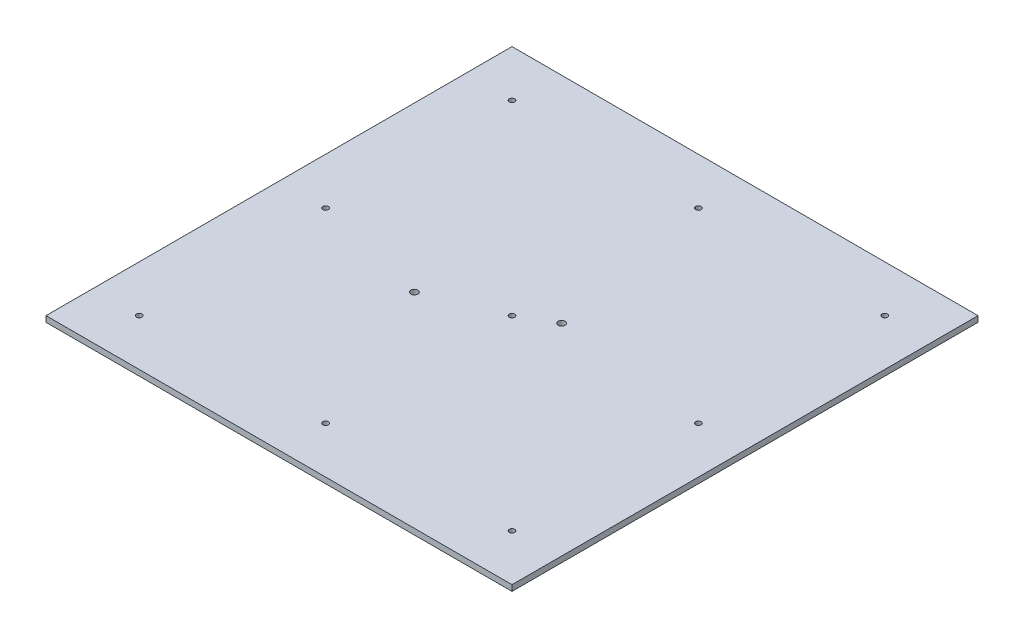
ISO-10303-21;
HEADER;
FILE_DESCRIPTION(('STEP AP214'),'2;1');
FILE_NAME('part.step','',(''),(''),'','','');
FILE_SCHEMA(('AUTOMOTIVE_DESIGN { 1 0 10303 214 1 1 1 1 }'));
ENDSEC;
DATA;
#1=APPLICATION_CONTEXT('core data for automotive mechanical design processes');
#2=APPLICATION_PROTOCOL_DEFINITION('international standard','automotive_design',2000,#1);
#3=PRODUCT_CONTEXT('',#1,'mechanical');
#4=PRODUCT('Part','Part','',(#3));
#5=PRODUCT_RELATED_PRODUCT_CATEGORY('part','',(#4));
#6=PRODUCT_DEFINITION_FORMATION('','',#4);
#7=PRODUCT_DEFINITION_CONTEXT('part definition',#1,'design');
#8=PRODUCT_DEFINITION('design','',#6,#7);
#9=PRODUCT_DEFINITION_SHAPE('','',#8);
#10=(LENGTH_UNIT() NAMED_UNIT(*) SI_UNIT(.MILLI.,.METRE.));
#11=(NAMED_UNIT(*) PLANE_ANGLE_UNIT() SI_UNIT($,.RADIAN.));
#12=(NAMED_UNIT(*) SI_UNIT($,.STERADIAN.) SOLID_ANGLE_UNIT());
#13=UNCERTAINTY_MEASURE_WITH_UNIT(LENGTH_MEASURE(1.E-05),#10,'distance_accuracy_value','');
#14=(GEOMETRIC_REPRESENTATION_CONTEXT(3) GLOBAL_UNCERTAINTY_ASSIGNED_CONTEXT((#13)) GLOBAL_UNIT_ASSIGNED_CONTEXT((#10,
#11,#12)) REPRESENTATION_CONTEXT('',''));
#15=CARTESIAN_POINT('',(0.,0.,0.));
#16=DIRECTION('',(0.,0.,1.));
#17=DIRECTION('',(1.,0.,0.));
#18=AXIS2_PLACEMENT_3D('',#15,#16,#17);
#19=CARTESIAN_POINT('',(-127.,3.175,-127.));
#20=DIRECTION('',(1.,0.,0.));
#21=DIRECTION('',(0.,0.,-1.));
#22=AXIS2_PLACEMENT_3D('',#19,#20,#21);
#23=PLANE('',#22);
#24=DIRECTION('',(0.,0.,1.));
#25=VECTOR('',#24,1.);
#26=CARTESIAN_POINT('',(-127.,0.,-127.));
#27=LINE('',#26,#25);
#28=CARTESIAN_POINT('',(-127.,0.,-127.));
#29=VERTEX_POINT('',#28);
#30=CARTESIAN_POINT('',(-127.,0.,127.));
#31=VERTEX_POINT('',#30);
#32=EDGE_CURVE('E106',#29,#31,#27,.T.);
#33=ORIENTED_EDGE('',*,*,#32,.T.);
#34=DIRECTION('',(0.,-1.,0.));
#35=VECTOR('',#34,1.);
#36=CARTESIAN_POINT('',(-127.,3.175,127.));
#37=LINE('',#36,#35);
#38=CARTESIAN_POINT('',(-127.,3.175,127.));
#39=VERTEX_POINT('',#38);
#40=EDGE_CURVE('E11',#39,#31,#37,.T.);
#41=ORIENTED_EDGE('',*,*,#40,.F.);
#42=DIRECTION('',(0.,0.,1.));
#43=VECTOR('',#42,1.);
#44=CARTESIAN_POINT('',(-127.,3.175,-127.));
#45=LINE('',#44,#43);
#46=CARTESIAN_POINT('',(-127.,3.175,-127.));
#47=VERTEX_POINT('',#46);
#48=EDGE_CURVE('E90',#47,#39,#45,.T.);
#49=ORIENTED_EDGE('',*,*,#48,.F.);
#50=DIRECTION('',(0.,-1.,0.));
#51=VECTOR('',#50,1.);
#52=CARTESIAN_POINT('',(-127.,3.175,-127.));
#53=LINE('',#52,#51);
#54=EDGE_CURVE('E102',#47,#29,#53,.T.);
#55=ORIENTED_EDGE('',*,*,#54,.T.);
#56=EDGE_LOOP('',(#33,#41,#49,#55));
#57=FACE_BOUND('',#56,.T.);
#58=ADVANCED_FACE('F38',(#57),#23,.F.);
#59=CARTESIAN_POINT('',(127.,3.175,127.));
#60=DIRECTION('',(0.,0.,-1.));
#61=DIRECTION('',(-1.,0.,0.));
#62=AXIS2_PLACEMENT_3D('',#59,#60,#61);
#63=PLANE('',#62);
#64=DIRECTION('',(1.,0.,0.));
#65=VECTOR('',#64,1.);
#66=CARTESIAN_POINT('',(127.,0.,127.));
#67=LINE('',#66,#65);
#68=CARTESIAN_POINT('',(127.,0.,127.));
#69=VERTEX_POINT('',#68);
#70=EDGE_CURVE('E95',#31,#69,#67,.T.);
#71=ORIENTED_EDGE('',*,*,#70,.T.);
#72=DIRECTION('',(0.,-1.,0.));
#73=VECTOR('',#72,1.);
#74=CARTESIAN_POINT('',(127.,3.175,127.));
#75=LINE('',#74,#73);
#76=CARTESIAN_POINT('',(127.,3.175,127.));
#77=VERTEX_POINT('',#76);
#78=EDGE_CURVE('E47',#77,#69,#75,.T.);
#79=ORIENTED_EDGE('',*,*,#78,.F.);
#80=DIRECTION('',(1.,0.,0.));
#81=VECTOR('',#80,1.);
#82=CARTESIAN_POINT('',(127.,3.175,127.));
#83=LINE('',#82,#81);
#84=EDGE_CURVE('E85',#39,#77,#83,.T.);
#85=ORIENTED_EDGE('',*,*,#84,.F.);
#86=ORIENTED_EDGE('',*,*,#40,.T.);
#87=EDGE_LOOP('',(#71,#79,#85,#86));
#88=FACE_BOUND('',#87,.T.);
#89=ADVANCED_FACE('F94',(#88),#63,.F.);
#90=CARTESIAN_POINT('',(127.,3.175,-127.));
#91=DIRECTION('',(-1.,0.,0.));
#92=DIRECTION('',(0.,0.,1.));
#93=AXIS2_PLACEMENT_3D('',#90,#91,#92);
#94=PLANE('',#93);
#95=DIRECTION('',(0.,0.,-1.));
#96=VECTOR('',#95,1.);
#97=CARTESIAN_POINT('',(127.,0.,-127.));
#98=LINE('',#97,#96);
#99=CARTESIAN_POINT('',(127.,0.,-127.));
#100=VERTEX_POINT('',#99);
#101=EDGE_CURVE('E72',#69,#100,#98,.T.);
#102=ORIENTED_EDGE('',*,*,#101,.T.);
#103=DIRECTION('',(0.,-1.,0.));
#104=VECTOR('',#103,1.);
#105=CARTESIAN_POINT('',(127.,3.175,-127.));
#106=LINE('',#105,#104);
#107=CARTESIAN_POINT('',(127.,3.175,-127.));
#108=VERTEX_POINT('',#107);
#109=EDGE_CURVE('E97',#108,#100,#106,.T.);
#110=ORIENTED_EDGE('',*,*,#109,.F.);
#111=DIRECTION('',(0.,0.,-1.));
#112=VECTOR('',#111,1.);
#113=CARTESIAN_POINT('',(127.,3.175,-127.));
#114=LINE('',#113,#112);
#115=EDGE_CURVE('E88',#77,#108,#114,.T.);
#116=ORIENTED_EDGE('',*,*,#115,.F.);
#117=ORIENTED_EDGE('',*,*,#78,.T.);
#118=EDGE_LOOP('',(#102,#110,#116,#117));
#119=FACE_BOUND('',#118,.T.);
#120=ADVANCED_FACE('F98',(#119),#94,.F.);
#121=CARTESIAN_POINT('',(127.,3.175,-127.));
#122=DIRECTION('',(0.,0.,1.));
#123=DIRECTION('',(1.,0.,0.));
#124=AXIS2_PLACEMENT_3D('',#121,#122,#123);
#125=PLANE('',#124);
#126=DIRECTION('',(-1.,0.,0.));
#127=VECTOR('',#126,1.);
#128=CARTESIAN_POINT('',(127.,0.,-127.));
#129=LINE('',#128,#127);
#130=EDGE_CURVE('E78',#100,#29,#129,.T.);
#131=ORIENTED_EDGE('',*,*,#130,.T.);
#132=ORIENTED_EDGE('',*,*,#54,.F.);
#133=DIRECTION('',(-1.,0.,0.));
#134=VECTOR('',#133,1.);
#135=CARTESIAN_POINT('',(127.,3.175,-127.));
#136=LINE('',#135,#134);
#137=EDGE_CURVE('E55',#108,#47,#136,.T.);
#138=ORIENTED_EDGE('',*,*,#137,.F.);
#139=ORIENTED_EDGE('',*,*,#109,.T.);
#140=EDGE_LOOP('',(#131,#132,#138,#139));
#141=FACE_BOUND('',#140,.T.);
#142=ADVANCED_FACE('F120',(#141),#125,.F.);
#143=CARTESIAN_POINT('',(0.,3.175,0.));
#144=DIRECTION('',(0.,-1.,0.));
#145=DIRECTION('',(0.,0.,-1.));
#146=AXIS2_PLACEMENT_3D('',#143,#144,#145);
#147=PLANE('',#146);
#148=CARTESIAN_POINT('',(17.145,3.175,-9.90600000000001));
#149=DIRECTION('',(0.,1.,0.));
#150=DIRECTION('',(0.,0.,1.));
#151=AXIS2_PLACEMENT_3D('',#148,#149,#150);
#152=CIRCLE('',#151,1.905);
#153=CARTESIAN_POINT('',(17.145,3.175,-8.00100000000001));
#154=VERTEX_POINT('',#153);
#155=EDGE_CURVE('E207',#154,#154,#152,.T.);
#156=ORIENTED_EDGE('',*,*,#155,.F.);
#157=EDGE_LOOP('',(#156));
#158=FACE_BOUND('',#157,.T.);
#159=CARTESIAN_POINT('',(-37.719,3.175,15.494));
#160=DIRECTION('',(0.,1.,0.));
#161=DIRECTION('',(0.,0.,1.));
#162=AXIS2_PLACEMENT_3D('',#159,#160,#161);
#163=CIRCLE('',#162,1.905);
#164=CARTESIAN_POINT('',(-37.719,3.175,17.399));
#165=VERTEX_POINT('',#164);
#166=EDGE_CURVE('E199',#165,#165,#163,.T.);
#167=ORIENTED_EDGE('',*,*,#166,.F.);
#168=EDGE_LOOP('',(#167));
#169=FACE_BOUND('',#168,.T.);
#170=CARTESIAN_POINT('',(0.,3.175,0.));
#171=DIRECTION('',(0.,1.,0.));
#172=DIRECTION('',(0.,0.,1.));
#173=AXIS2_PLACEMENT_3D('',#170,#171,#172);
#174=CIRCLE('',#173,1.49999999999999);
#175=CARTESIAN_POINT('',(0.,3.175,1.49999999999999));
#176=VERTEX_POINT('',#175);
#177=EDGE_CURVE('E194',#176,#176,#174,.T.);
#178=ORIENTED_EDGE('',*,*,#177,.F.);
#179=EDGE_LOOP('',(#178));
#180=FACE_BOUND('',#179,.T.);
#181=CARTESIAN_POINT('',(-101.6,3.175,0.));
#182=DIRECTION('',(0.,1.,0.));
#183=DIRECTION('',(0.,0.,1.));
#184=AXIS2_PLACEMENT_3D('',#181,#182,#183);
#185=CIRCLE('',#184,1.49999999999999);
#186=CARTESIAN_POINT('',(-101.6,3.175,1.49999999999999));
#187=VERTEX_POINT('',#186);
#188=EDGE_CURVE('E186',#187,#187,#185,.T.);
#189=ORIENTED_EDGE('',*,*,#188,.F.);
#190=EDGE_LOOP('',(#189));
#191=FACE_BOUND('',#190,.T.);
#192=CARTESIAN_POINT('',(101.6,3.175,0.));
#193=DIRECTION('',(0.,1.,0.));
#194=DIRECTION('',(0.,0.,1.));
#195=AXIS2_PLACEMENT_3D('',#192,#193,#194);
#196=CIRCLE('',#195,1.49999999999999);
#197=CARTESIAN_POINT('',(101.6,3.175,1.49999999999996));
#198=VERTEX_POINT('',#197);
#199=EDGE_CURVE('E178',#198,#198,#196,.T.);
#200=ORIENTED_EDGE('',*,*,#199,.F.);
#201=EDGE_LOOP('',(#200));
#202=FACE_BOUND('',#201,.T.);
#203=CARTESIAN_POINT('',(101.6,3.175,101.6));
#204=DIRECTION('',(0.,1.,0.));
#205=DIRECTION('',(0.,0.,1.));
#206=AXIS2_PLACEMENT_3D('',#203,#204,#205);
#207=CIRCLE('',#206,1.49999999999999);
#208=CARTESIAN_POINT('',(101.6,3.175,103.1));
#209=VERTEX_POINT('',#208);
#210=EDGE_CURVE('E170',#209,#209,#207,.T.);
#211=ORIENTED_EDGE('',*,*,#210,.F.);
#212=EDGE_LOOP('',(#211));
#213=FACE_BOUND('',#212,.T.);
#214=CARTESIAN_POINT('',(0.,3.175,101.6));
#215=DIRECTION('',(0.,1.,0.));
#216=DIRECTION('',(0.,0.,1.));
#217=AXIS2_PLACEMENT_3D('',#214,#215,#216);
#218=CIRCLE('',#217,1.49999999999999);
#219=CARTESIAN_POINT('',(0.,3.175,103.1));
#220=VERTEX_POINT('',#219);
#221=EDGE_CURVE('E162',#220,#220,#218,.T.);
#222=ORIENTED_EDGE('',*,*,#221,.F.);
#223=EDGE_LOOP('',(#222));
#224=FACE_BOUND('',#223,.T.);
#225=CARTESIAN_POINT('',(-101.6,3.175,101.6));
#226=DIRECTION('',(0.,1.,0.));
#227=DIRECTION('',(0.,0.,1.));
#228=AXIS2_PLACEMENT_3D('',#225,#226,#227);
#229=CIRCLE('',#228,1.49999999999999);
#230=CARTESIAN_POINT('',(-101.6,3.175,103.1));
#231=VERTEX_POINT('',#230);
#232=EDGE_CURVE('E154',#231,#231,#229,.T.);
#233=ORIENTED_EDGE('',*,*,#232,.F.);
#234=EDGE_LOOP('',(#233));
#235=FACE_BOUND('',#234,.T.);
#236=CARTESIAN_POINT('',(-101.6,3.175,-101.6));
#237=DIRECTION('',(0.,1.,0.));
#238=DIRECTION('',(0.,0.,1.));
#239=AXIS2_PLACEMENT_3D('',#236,#237,#238);
#240=CIRCLE('',#239,1.49999999999999);
#241=CARTESIAN_POINT('',(-101.6,3.175,-100.1));
#242=VERTEX_POINT('',#241);
#243=EDGE_CURVE('E146',#242,#242,#240,.T.);
#244=ORIENTED_EDGE('',*,*,#243,.F.);
#245=EDGE_LOOP('',(#244));
#246=FACE_BOUND('',#245,.T.);
#247=CARTESIAN_POINT('',(0.,3.175,-101.6));
#248=DIRECTION('',(0.,1.,0.));
#249=DIRECTION('',(0.,0.,1.));
#250=AXIS2_PLACEMENT_3D('',#247,#248,#249);
#251=CIRCLE('',#250,1.49999999999999);
#252=CARTESIAN_POINT('',(0.,3.175,-100.1));
#253=VERTEX_POINT('',#252);
#254=EDGE_CURVE('E138',#253,#253,#251,.T.);
#255=ORIENTED_EDGE('',*,*,#254,.F.);
#256=EDGE_LOOP('',(#255));
#257=FACE_BOUND('',#256,.T.);
#258=CARTESIAN_POINT('',(101.6,3.175,-101.6));
#259=DIRECTION('',(0.,1.,0.));
#260=DIRECTION('',(0.,0.,1.));
#261=AXIS2_PLACEMENT_3D('',#258,#259,#260);
#262=CIRCLE('',#261,1.49999999999999);
#263=CARTESIAN_POINT('',(101.6,3.175,-100.1));
#264=VERTEX_POINT('',#263);
#265=EDGE_CURVE('E130',#264,#264,#262,.T.);
#266=ORIENTED_EDGE('',*,*,#265,.F.);
#267=EDGE_LOOP('',(#266));
#268=FACE_BOUND('',#267,.T.);
#269=ORIENTED_EDGE('',*,*,#48,.T.);
#270=ORIENTED_EDGE('',*,*,#84,.T.);
#271=ORIENTED_EDGE('',*,*,#115,.T.);
#272=ORIENTED_EDGE('',*,*,#137,.T.);
#273=EDGE_LOOP('',(#269,#270,#271,#272));
#274=FACE_BOUND('',#273,.T.);
#275=ADVANCED_FACE('F86',(#158,#169,#180,#191,#202,#213,#224,#235,#246,#257,#268,#274),#147,.F.);
#276=CARTESIAN_POINT('',(0.,0.,0.));
#277=DIRECTION('',(0.,-1.,0.));
#278=DIRECTION('',(0.,0.,-1.));
#279=AXIS2_PLACEMENT_3D('',#276,#277,#278);
#280=PLANE('',#279);
#281=CARTESIAN_POINT('',(17.145,0.,-9.90600000000001));
#282=DIRECTION('',(0.,1.,0.));
#283=DIRECTION('',(0.,0.,1.));
#284=AXIS2_PLACEMENT_3D('',#281,#282,#283);
#285=CIRCLE('',#284,1.905);
#286=CARTESIAN_POINT('',(17.145,0.,-8.00100000000001));
#287=VERTEX_POINT('',#286);
#288=EDGE_CURVE('E198',#287,#287,#285,.T.);
#289=ORIENTED_EDGE('',*,*,#288,.T.);
#290=EDGE_LOOP('',(#289));
#291=FACE_BOUND('',#290,.T.);
#292=CARTESIAN_POINT('',(-37.719,0.,15.494));
#293=DIRECTION('',(0.,1.,0.));
#294=DIRECTION('',(0.,0.,1.));
#295=AXIS2_PLACEMENT_3D('',#292,#293,#294);
#296=CIRCLE('',#295,1.905);
#297=CARTESIAN_POINT('',(-37.719,0.,17.399));
#298=VERTEX_POINT('',#297);
#299=EDGE_CURVE('E203',#298,#298,#296,.T.);
#300=ORIENTED_EDGE('',*,*,#299,.T.);
#301=EDGE_LOOP('',(#300));
#302=FACE_BOUND('',#301,.T.);
#303=CARTESIAN_POINT('',(0.,0.,0.));
#304=DIRECTION('',(0.,1.,0.));
#305=DIRECTION('',(0.,0.,1.));
#306=AXIS2_PLACEMENT_3D('',#303,#304,#305);
#307=CIRCLE('',#306,1.5);
#308=CARTESIAN_POINT('',(0.,0.,1.5));
#309=VERTEX_POINT('',#308);
#310=EDGE_CURVE('E190',#309,#309,#307,.T.);
#311=ORIENTED_EDGE('',*,*,#310,.T.);
#312=EDGE_LOOP('',(#311));
#313=FACE_BOUND('',#312,.T.);
#314=CARTESIAN_POINT('',(-101.6,0.,0.));
#315=DIRECTION('',(0.,1.,0.));
#316=DIRECTION('',(0.,0.,1.));
#317=AXIS2_PLACEMENT_3D('',#314,#315,#316);
#318=CIRCLE('',#317,1.5);
#319=CARTESIAN_POINT('',(-101.6,0.,1.5));
#320=VERTEX_POINT('',#319);
#321=EDGE_CURVE('E182',#320,#320,#318,.T.);
#322=ORIENTED_EDGE('',*,*,#321,.T.);
#323=EDGE_LOOP('',(#322));
#324=FACE_BOUND('',#323,.T.);
#325=CARTESIAN_POINT('',(101.6,0.,0.));
#326=DIRECTION('',(0.,1.,0.));
#327=DIRECTION('',(0.,0.,1.));
#328=AXIS2_PLACEMENT_3D('',#325,#326,#327);
#329=CIRCLE('',#328,1.5);
#330=CARTESIAN_POINT('',(101.6,0.,1.49999999999998));
#331=VERTEX_POINT('',#330);
#332=EDGE_CURVE('E174',#331,#331,#329,.T.);
#333=ORIENTED_EDGE('',*,*,#332,.T.);
#334=EDGE_LOOP('',(#333));
#335=FACE_BOUND('',#334,.T.);
#336=CARTESIAN_POINT('',(101.6,0.,101.6));
#337=DIRECTION('',(0.,1.,0.));
#338=DIRECTION('',(0.,0.,1.));
#339=AXIS2_PLACEMENT_3D('',#336,#337,#338);
#340=CIRCLE('',#339,1.5);
#341=CARTESIAN_POINT('',(101.6,0.,103.1));
#342=VERTEX_POINT('',#341);
#343=EDGE_CURVE('E166',#342,#342,#340,.T.);
#344=ORIENTED_EDGE('',*,*,#343,.T.);
#345=EDGE_LOOP('',(#344));
#346=FACE_BOUND('',#345,.T.);
#347=CARTESIAN_POINT('',(0.,0.,101.6));
#348=DIRECTION('',(0.,1.,0.));
#349=DIRECTION('',(0.,0.,1.));
#350=AXIS2_PLACEMENT_3D('',#347,#348,#349);
#351=CIRCLE('',#350,1.5);
#352=CARTESIAN_POINT('',(0.,0.,103.1));
#353=VERTEX_POINT('',#352);
#354=EDGE_CURVE('E158',#353,#353,#351,.T.);
#355=ORIENTED_EDGE('',*,*,#354,.T.);
#356=EDGE_LOOP('',(#355));
#357=FACE_BOUND('',#356,.T.);
#358=CARTESIAN_POINT('',(-101.6,0.,101.6));
#359=DIRECTION('',(0.,1.,0.));
#360=DIRECTION('',(0.,0.,1.));
#361=AXIS2_PLACEMENT_3D('',#358,#359,#360);
#362=CIRCLE('',#361,1.5);
#363=CARTESIAN_POINT('',(-101.6,0.,103.1));
#364=VERTEX_POINT('',#363);
#365=EDGE_CURVE('E150',#364,#364,#362,.T.);
#366=ORIENTED_EDGE('',*,*,#365,.T.);
#367=EDGE_LOOP('',(#366));
#368=FACE_BOUND('',#367,.T.);
#369=CARTESIAN_POINT('',(-101.6,0.,-101.6));
#370=DIRECTION('',(0.,1.,0.));
#371=DIRECTION('',(0.,0.,1.));
#372=AXIS2_PLACEMENT_3D('',#369,#370,#371);
#373=CIRCLE('',#372,1.5);
#374=CARTESIAN_POINT('',(-101.6,0.,-100.1));
#375=VERTEX_POINT('',#374);
#376=EDGE_CURVE('E142',#375,#375,#373,.T.);
#377=ORIENTED_EDGE('',*,*,#376,.T.);
#378=EDGE_LOOP('',(#377));
#379=FACE_BOUND('',#378,.T.);
#380=CARTESIAN_POINT('',(0.,0.,-101.6));
#381=DIRECTION('',(0.,1.,0.));
#382=DIRECTION('',(0.,0.,1.));
#383=AXIS2_PLACEMENT_3D('',#380,#381,#382);
#384=CIRCLE('',#383,1.5);
#385=CARTESIAN_POINT('',(0.,0.,-100.1));
#386=VERTEX_POINT('',#385);
#387=EDGE_CURVE('E134',#386,#386,#384,.T.);
#388=ORIENTED_EDGE('',*,*,#387,.T.);
#389=EDGE_LOOP('',(#388));
#390=FACE_BOUND('',#389,.T.);
#391=CARTESIAN_POINT('',(101.6,0.,-101.6));
#392=DIRECTION('',(0.,1.,0.));
#393=DIRECTION('',(0.,0.,1.));
#394=AXIS2_PLACEMENT_3D('',#391,#392,#393);
#395=CIRCLE('',#394,1.5);
#396=CARTESIAN_POINT('',(101.6,0.,-100.1));
#397=VERTEX_POINT('',#396);
#398=EDGE_CURVE('E110',#397,#397,#395,.T.);
#399=ORIENTED_EDGE('',*,*,#398,.T.);
#400=EDGE_LOOP('',(#399));
#401=FACE_BOUND('',#400,.T.);
#402=ORIENTED_EDGE('',*,*,#32,.F.);
#403=ORIENTED_EDGE('',*,*,#130,.F.);
#404=ORIENTED_EDGE('',*,*,#101,.F.);
#405=ORIENTED_EDGE('',*,*,#70,.F.);
#406=EDGE_LOOP('',(#402,#403,#404,#405));
#407=FACE_BOUND('',#406,.T.);
#408=ADVANCED_FACE('F123',(#291,#302,#313,#324,#335,#346,#357,#368,#379,#390,#401,#407),#280,.T.);
#409=CARTESIAN_POINT('',(101.6,3.175,-101.6));
#410=DIRECTION('',(0.,1.,0.));
#411=DIRECTION('',(0.,0.,1.));
#412=AXIS2_PLACEMENT_3D('',#409,#410,#411);
#413=CYLINDRICAL_SURFACE('',#412,1.49999999999999);
#414=ORIENTED_EDGE('',*,*,#398,.F.);
#415=EDGE_LOOP('',(#414));
#416=FACE_BOUND('',#415,.T.);
#417=ORIENTED_EDGE('',*,*,#265,.T.);
#418=EDGE_LOOP('',(#417));
#419=FACE_BOUND('',#418,.T.);
#420=ADVANCED_FACE('F247',(#416,#419),#413,.F.);
#421=CARTESIAN_POINT('',(0.,3.175,-101.6));
#422=DIRECTION('',(0.,1.,0.));
#423=DIRECTION('',(0.,0.,1.));
#424=AXIS2_PLACEMENT_3D('',#421,#422,#423);
#425=CYLINDRICAL_SURFACE('',#424,1.49999999999999);
#426=ORIENTED_EDGE('',*,*,#387,.F.);
#427=EDGE_LOOP('',(#426));
#428=FACE_BOUND('',#427,.T.);
#429=ORIENTED_EDGE('',*,*,#254,.T.);
#430=EDGE_LOOP('',(#429));
#431=FACE_BOUND('',#430,.T.);
#432=ADVANCED_FACE('F249',(#428,#431),#425,.F.);
#433=CARTESIAN_POINT('',(-101.6,3.175,-101.6));
#434=DIRECTION('',(0.,1.,0.));
#435=DIRECTION('',(0.,0.,1.));
#436=AXIS2_PLACEMENT_3D('',#433,#434,#435);
#437=CYLINDRICAL_SURFACE('',#436,1.49999999999999);
#438=ORIENTED_EDGE('',*,*,#376,.F.);
#439=EDGE_LOOP('',(#438));
#440=FACE_BOUND('',#439,.T.);
#441=ORIENTED_EDGE('',*,*,#243,.T.);
#442=EDGE_LOOP('',(#441));
#443=FACE_BOUND('',#442,.T.);
#444=ADVANCED_FACE('F256',(#440,#443),#437,.F.);
#445=CARTESIAN_POINT('',(-101.6,3.175,101.6));
#446=DIRECTION('',(0.,1.,0.));
#447=DIRECTION('',(0.,0.,1.));
#448=AXIS2_PLACEMENT_3D('',#445,#446,#447);
#449=CYLINDRICAL_SURFACE('',#448,1.49999999999999);
#450=ORIENTED_EDGE('',*,*,#365,.F.);
#451=EDGE_LOOP('',(#450));
#452=FACE_BOUND('',#451,.T.);
#453=ORIENTED_EDGE('',*,*,#232,.T.);
#454=EDGE_LOOP('',(#453));
#455=FACE_BOUND('',#454,.T.);
#456=ADVANCED_FACE('F342',(#452,#455),#449,.F.);
#457=CARTESIAN_POINT('',(0.,3.175,101.6));
#458=DIRECTION('',(0.,1.,0.));
#459=DIRECTION('',(0.,0.,1.));
#460=AXIS2_PLACEMENT_3D('',#457,#458,#459);
#461=CYLINDRICAL_SURFACE('',#460,1.49999999999999);
#462=ORIENTED_EDGE('',*,*,#354,.F.);
#463=EDGE_LOOP('',(#462));
#464=FACE_BOUND('',#463,.T.);
#465=ORIENTED_EDGE('',*,*,#221,.T.);
#466=EDGE_LOOP('',(#465));
#467=FACE_BOUND('',#466,.T.);
#468=ADVANCED_FACE('F334',(#464,#467),#461,.F.);
#469=CARTESIAN_POINT('',(101.6,3.175,101.6));
#470=DIRECTION('',(0.,1.,0.));
#471=DIRECTION('',(0.,0.,1.));
#472=AXIS2_PLACEMENT_3D('',#469,#470,#471);
#473=CYLINDRICAL_SURFACE('',#472,1.49999999999999);
#474=ORIENTED_EDGE('',*,*,#343,.F.);
#475=EDGE_LOOP('',(#474));
#476=FACE_BOUND('',#475,.T.);
#477=ORIENTED_EDGE('',*,*,#210,.T.);
#478=EDGE_LOOP('',(#477));
#479=FACE_BOUND('',#478,.T.);
#480=ADVANCED_FACE('F326',(#476,#479),#473,.F.);
#481=CARTESIAN_POINT('',(101.6,3.175,0.));
#482=DIRECTION('',(0.,1.,0.));
#483=DIRECTION('',(0.,0.,1.));
#484=AXIS2_PLACEMENT_3D('',#481,#482,#483);
#485=CYLINDRICAL_SURFACE('',#484,1.49999999999999);
#486=ORIENTED_EDGE('',*,*,#332,.F.);
#487=EDGE_LOOP('',(#486));
#488=FACE_BOUND('',#487,.T.);
#489=ORIENTED_EDGE('',*,*,#199,.T.);
#490=EDGE_LOOP('',(#489));
#491=FACE_BOUND('',#490,.T.);
#492=ADVANCED_FACE('F318',(#488,#491),#485,.F.);
#493=CARTESIAN_POINT('',(-101.6,3.175,0.));
#494=DIRECTION('',(0.,1.,0.));
#495=DIRECTION('',(0.,0.,1.));
#496=AXIS2_PLACEMENT_3D('',#493,#494,#495);
#497=CYLINDRICAL_SURFACE('',#496,1.49999999999999);
#498=ORIENTED_EDGE('',*,*,#321,.F.);
#499=EDGE_LOOP('',(#498));
#500=FACE_BOUND('',#499,.T.);
#501=ORIENTED_EDGE('',*,*,#188,.T.);
#502=EDGE_LOOP('',(#501));
#503=FACE_BOUND('',#502,.T.);
#504=ADVANCED_FACE('F311',(#500,#503),#497,.F.);
#505=CARTESIAN_POINT('',(0.,3.175,0.));
#506=DIRECTION('',(0.,1.,0.));
#507=DIRECTION('',(0.,0.,1.));
#508=AXIS2_PLACEMENT_3D('',#505,#506,#507);
#509=CYLINDRICAL_SURFACE('',#508,1.49999999999999);
#510=ORIENTED_EDGE('',*,*,#310,.F.);
#511=EDGE_LOOP('',(#510));
#512=FACE_BOUND('',#511,.T.);
#513=ORIENTED_EDGE('',*,*,#177,.T.);
#514=EDGE_LOOP('',(#513));
#515=FACE_BOUND('',#514,.T.);
#516=ADVANCED_FACE('F296',(#512,#515),#509,.F.);
#517=CARTESIAN_POINT('',(-37.719,0.,15.494));
#518=DIRECTION('',(0.,1.,0.));
#519=DIRECTION('',(0.,0.,1.));
#520=AXIS2_PLACEMENT_3D('',#517,#518,#519);
#521=CYLINDRICAL_SURFACE('',#520,1.905);
#522=ORIENTED_EDGE('',*,*,#299,.F.);
#523=EDGE_LOOP('',(#522));
#524=FACE_BOUND('',#523,.T.);
#525=ORIENTED_EDGE('',*,*,#166,.T.);
#526=EDGE_LOOP('',(#525));
#527=FACE_BOUND('',#526,.T.);
#528=ADVANCED_FACE('F220',(#524,#527),#521,.F.);
#529=CARTESIAN_POINT('',(17.145,0.,-9.90600000000001));
#530=DIRECTION('',(0.,1.,0.));
#531=DIRECTION('',(0.,0.,1.));
#532=AXIS2_PLACEMENT_3D('',#529,#530,#531);
#533=CYLINDRICAL_SURFACE('',#532,1.905);
#534=ORIENTED_EDGE('',*,*,#288,.F.);
#535=EDGE_LOOP('',(#534));
#536=FACE_BOUND('',#535,.T.);
#537=ORIENTED_EDGE('',*,*,#155,.T.);
#538=EDGE_LOOP('',(#537));
#539=FACE_BOUND('',#538,.T.);
#540=ADVANCED_FACE('F217',(#536,#539),#533,.F.);
#541=CLOSED_SHELL('',(#58,#89,#120,#142,#275,#408,#420,#432,#444,#456,#468,#480,#492,#504,#516,
#528,#540));
#542=MANIFOLD_SOLID_BREP('B2',#541);
#543=ADVANCED_BREP_SHAPE_REPRESENTATION('',(#18,#542),#14);
#544=SHAPE_DEFINITION_REPRESENTATION(#9,#543);
ENDSEC;
END-ISO-10303-21;
